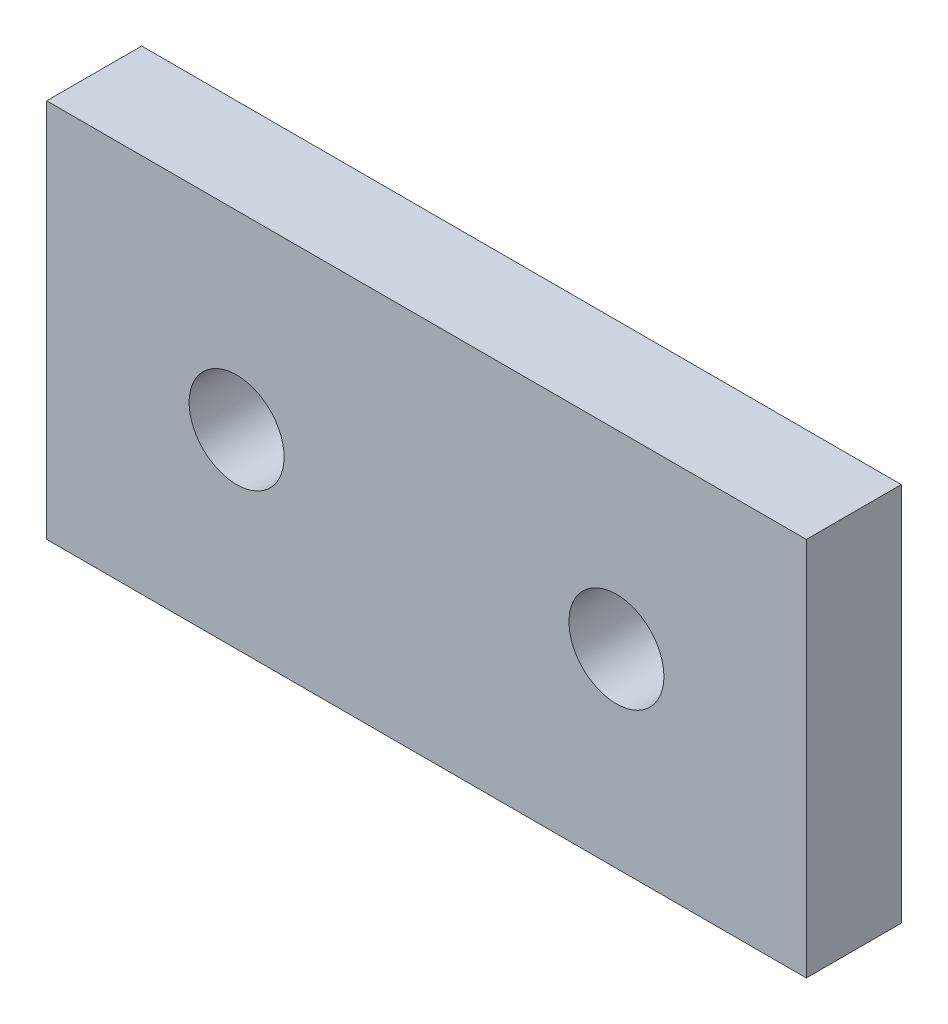
ISO-10303-21;
HEADER;
FILE_DESCRIPTION(('STEP AP214'),'2;1');
FILE_NAME('part.step','',(''),(''),'','','');
FILE_SCHEMA(('AUTOMOTIVE_DESIGN { 1 0 10303 214 1 1 1 1 }'));
ENDSEC;
DATA;
#1=APPLICATION_CONTEXT('core data for automotive mechanical design processes');
#2=APPLICATION_PROTOCOL_DEFINITION('international standard','automotive_design',2000,#1);
#3=PRODUCT_CONTEXT('',#1,'mechanical');
#4=PRODUCT('Part','Part','',(#3));
#5=PRODUCT_RELATED_PRODUCT_CATEGORY('part','',(#4));
#6=PRODUCT_DEFINITION_FORMATION('','',#4);
#7=PRODUCT_DEFINITION_CONTEXT('part definition',#1,'design');
#8=PRODUCT_DEFINITION('design','',#6,#7);
#9=PRODUCT_DEFINITION_SHAPE('','',#8);
#10=(LENGTH_UNIT() NAMED_UNIT(*) SI_UNIT(.MILLI.,.METRE.));
#11=(NAMED_UNIT(*) PLANE_ANGLE_UNIT() SI_UNIT($,.RADIAN.));
#12=(NAMED_UNIT(*) SI_UNIT($,.STERADIAN.) SOLID_ANGLE_UNIT());
#13=UNCERTAINTY_MEASURE_WITH_UNIT(LENGTH_MEASURE(1.E-05),#10,'distance_accuracy_value','');
#14=(GEOMETRIC_REPRESENTATION_CONTEXT(3) GLOBAL_UNCERTAINTY_ASSIGNED_CONTEXT((#13)) GLOBAL_UNIT_ASSIGNED_CONTEXT((#10,
#11,#12)) REPRESENTATION_CONTEXT('',''));
#15=CARTESIAN_POINT('',(0.,0.,0.));
#16=DIRECTION('',(0.,0.,1.));
#17=DIRECTION('',(1.,0.,0.));
#18=AXIS2_PLACEMENT_3D('',#15,#16,#17);
#19=CARTESIAN_POINT('',(0.,40.,5.));
#20=DIRECTION('',(1.,0.,0.));
#21=DIRECTION('',(0.,0.,-1.));
#22=AXIS2_PLACEMENT_3D('',#19,#20,#21);
#23=PLANE('',#22);
#24=DIRECTION('',(0.,-1.,0.));
#25=VECTOR('',#24,1.);
#26=CARTESIAN_POINT('',(0.,40.,-5.));
#27=LINE('',#26,#25);
#28=CARTESIAN_POINT('',(0.,40.,-5.));
#29=VERTEX_POINT('',#28);
#30=CARTESIAN_POINT('',(0.,0.,-5.));
#31=VERTEX_POINT('',#30);
#32=EDGE_CURVE('E120',#29,#31,#27,.T.);
#33=ORIENTED_EDGE('',*,*,#32,.T.);
#34=DIRECTION('',(0.,0.,-1.));
#35=VECTOR('',#34,1.);
#36=CARTESIAN_POINT('',(0.,0.,5.));
#37=LINE('',#36,#35);
#38=CARTESIAN_POINT('',(0.,0.,5.));
#39=VERTEX_POINT('',#38);
#40=EDGE_CURVE('E11',#39,#31,#37,.T.);
#41=ORIENTED_EDGE('',*,*,#40,.F.);
#42=DIRECTION('',(0.,-1.,0.));
#43=VECTOR('',#42,1.);
#44=CARTESIAN_POINT('',(0.,40.,5.));
#45=LINE('',#44,#43);
#46=CARTESIAN_POINT('',(0.,40.,5.));
#47=VERTEX_POINT('',#46);
#48=EDGE_CURVE('E104',#47,#39,#45,.T.);
#49=ORIENTED_EDGE('',*,*,#48,.F.);
#50=DIRECTION('',(0.,0.,-1.));
#51=VECTOR('',#50,1.);
#52=CARTESIAN_POINT('',(0.,40.,5.));
#53=LINE('',#52,#51);
#54=EDGE_CURVE('E116',#47,#29,#53,.T.);
#55=ORIENTED_EDGE('',*,*,#54,.T.);
#56=EDGE_LOOP('',(#33,#41,#49,#55));
#57=FACE_BOUND('',#56,.T.);
#58=ADVANCED_FACE('F51',(#57),#23,.F.);
#59=CARTESIAN_POINT('',(0.,0.,5.));
#60=DIRECTION('',(0.,1.,0.));
#61=DIRECTION('',(0.,0.,1.));
#62=AXIS2_PLACEMENT_3D('',#59,#60,#61);
#63=PLANE('',#62);
#64=DIRECTION('',(1.,0.,0.));
#65=VECTOR('',#64,1.);
#66=CARTESIAN_POINT('',(0.,0.,-5.));
#67=LINE('',#66,#65);
#68=CARTESIAN_POINT('',(80.,0.,-5.));
#69=VERTEX_POINT('',#68);
#70=EDGE_CURVE('E109',#31,#69,#67,.T.);
#71=ORIENTED_EDGE('',*,*,#70,.T.);
#72=DIRECTION('',(0.,0.,-1.));
#73=VECTOR('',#72,1.);
#74=CARTESIAN_POINT('',(80.,0.,5.));
#75=LINE('',#74,#73);
#76=CARTESIAN_POINT('',(80.,0.,5.));
#77=VERTEX_POINT('',#76);
#78=EDGE_CURVE('E61',#77,#69,#75,.T.);
#79=ORIENTED_EDGE('',*,*,#78,.F.);
#80=DIRECTION('',(1.,0.,0.));
#81=VECTOR('',#80,1.);
#82=CARTESIAN_POINT('',(0.,0.,5.));
#83=LINE('',#82,#81);
#84=EDGE_CURVE('E99',#39,#77,#83,.T.);
#85=ORIENTED_EDGE('',*,*,#84,.F.);
#86=ORIENTED_EDGE('',*,*,#40,.T.);
#87=EDGE_LOOP('',(#71,#79,#85,#86));
#88=FACE_BOUND('',#87,.T.);
#89=ADVANCED_FACE('F108',(#88),#63,.F.);
#90=CARTESIAN_POINT('',(80.,0.,5.));
#91=DIRECTION('',(-1.,0.,0.));
#92=DIRECTION('',(0.,0.,1.));
#93=AXIS2_PLACEMENT_3D('',#90,#91,#92);
#94=PLANE('',#93);
#95=DIRECTION('',(0.,1.,0.));
#96=VECTOR('',#95,1.);
#97=CARTESIAN_POINT('',(80.,0.,-5.));
#98=LINE('',#97,#96);
#99=CARTESIAN_POINT('',(80.,40.,-5.));
#100=VERTEX_POINT('',#99);
#101=EDGE_CURVE('E86',#69,#100,#98,.T.);
#102=ORIENTED_EDGE('',*,*,#101,.T.);
#103=DIRECTION('',(0.,0.,-1.));
#104=VECTOR('',#103,1.);
#105=CARTESIAN_POINT('',(80.,40.,5.));
#106=LINE('',#105,#104);
#107=CARTESIAN_POINT('',(80.,40.,5.));
#108=VERTEX_POINT('',#107);
#109=EDGE_CURVE('E111',#108,#100,#106,.T.);
#110=ORIENTED_EDGE('',*,*,#109,.F.);
#111=DIRECTION('',(0.,1.,0.));
#112=VECTOR('',#111,1.);
#113=CARTESIAN_POINT('',(80.,0.,5.));
#114=LINE('',#113,#112);
#115=EDGE_CURVE('E102',#77,#108,#114,.T.);
#116=ORIENTED_EDGE('',*,*,#115,.F.);
#117=ORIENTED_EDGE('',*,*,#78,.T.);
#118=EDGE_LOOP('',(#102,#110,#116,#117));
#119=FACE_BOUND('',#118,.T.);
#120=ADVANCED_FACE('F112',(#119),#94,.F.);
#121=CARTESIAN_POINT('',(80.,40.,5.));
#122=DIRECTION('',(0.,-1.,0.));
#123=DIRECTION('',(0.,0.,-1.));
#124=AXIS2_PLACEMENT_3D('',#121,#122,#123);
#125=PLANE('',#124);
#126=DIRECTION('',(-1.,0.,0.));
#127=VECTOR('',#126,1.);
#128=CARTESIAN_POINT('',(80.,40.,-5.));
#129=LINE('',#128,#127);
#130=EDGE_CURVE('E92',#100,#29,#129,.T.);
#131=ORIENTED_EDGE('',*,*,#130,.T.);
#132=ORIENTED_EDGE('',*,*,#54,.F.);
#133=DIRECTION('',(-1.,0.,0.));
#134=VECTOR('',#133,1.);
#135=CARTESIAN_POINT('',(80.,40.,5.));
#136=LINE('',#135,#134);
#137=EDGE_CURVE('E69',#108,#47,#136,.T.);
#138=ORIENTED_EDGE('',*,*,#137,.F.);
#139=ORIENTED_EDGE('',*,*,#109,.T.);
#140=EDGE_LOOP('',(#131,#132,#138,#139));
#141=FACE_BOUND('',#140,.T.);
#142=ADVANCED_FACE('F135',(#141),#125,.F.);
#143=CARTESIAN_POINT('',(0.,0.,5.));
#144=DIRECTION('',(0.,0.,1.));
#145=DIRECTION('',(1.,0.,0.));
#146=AXIS2_PLACEMENT_3D('',#143,#144,#145);
#147=PLANE('',#146);
#148=CARTESIAN_POINT('',(20.,20.,5.));
#149=DIRECTION('',(0.,0.,1.));
#150=DIRECTION('',(1.,0.,0.));
#151=AXIS2_PLACEMENT_3D('',#148,#149,#150);
#152=CIRCLE('',#151,5.);
#153=CARTESIAN_POINT('',(25.,20.,5.));
#154=VERTEX_POINT('',#153);
#155=EDGE_CURVE('E150',#154,#154,#152,.T.);
#156=ORIENTED_EDGE('',*,*,#155,.F.);
#157=EDGE_LOOP('',(#156));
#158=FACE_BOUND('',#157,.T.);
#159=CARTESIAN_POINT('',(60.,20.,5.));
#160=DIRECTION('',(0.,0.,1.));
#161=DIRECTION('',(1.,0.,0.));
#162=AXIS2_PLACEMENT_3D('',#159,#160,#161);
#163=CIRCLE('',#162,5.);
#164=CARTESIAN_POINT('',(65.,20.,5.));
#165=VERTEX_POINT('',#164);
#166=EDGE_CURVE('E146',#165,#165,#163,.T.);
#167=ORIENTED_EDGE('',*,*,#166,.F.);
#168=EDGE_LOOP('',(#167));
#169=FACE_BOUND('',#168,.T.);
#170=ORIENTED_EDGE('',*,*,#48,.T.);
#171=ORIENTED_EDGE('',*,*,#84,.T.);
#172=ORIENTED_EDGE('',*,*,#115,.T.);
#173=ORIENTED_EDGE('',*,*,#137,.T.);
#174=EDGE_LOOP('',(#170,#171,#172,#173));
#175=FACE_BOUND('',#174,.T.);
#176=ADVANCED_FACE('F100',(#158,#169,#175),#147,.T.);
#177=CARTESIAN_POINT('',(0.,0.,-5.));
#178=DIRECTION('',(0.,0.,1.));
#179=DIRECTION('',(1.,0.,0.));
#180=AXIS2_PLACEMENT_3D('',#177,#178,#179);
#181=PLANE('',#180);
#182=CARTESIAN_POINT('',(20.,20.,-5.));
#183=DIRECTION('',(0.,0.,1.));
#184=DIRECTION('',(1.,0.,0.));
#185=AXIS2_PLACEMENT_3D('',#182,#183,#184);
#186=CIRCLE('',#185,5.);
#187=CARTESIAN_POINT('',(25.,20.,-5.));
#188=VERTEX_POINT('',#187);
#189=EDGE_CURVE('E124',#188,#188,#186,.T.);
#190=ORIENTED_EDGE('',*,*,#189,.T.);
#191=EDGE_LOOP('',(#190));
#192=FACE_BOUND('',#191,.T.);
#193=CARTESIAN_POINT('',(60.,20.,-5.));
#194=DIRECTION('',(0.,0.,1.));
#195=DIRECTION('',(1.,0.,0.));
#196=AXIS2_PLACEMENT_3D('',#193,#194,#195);
#197=CIRCLE('',#196,5.);
#198=CARTESIAN_POINT('',(65.,20.,-5.));
#199=VERTEX_POINT('',#198);
#200=EDGE_CURVE('E143',#199,#199,#197,.T.);
#201=ORIENTED_EDGE('',*,*,#200,.T.);
#202=EDGE_LOOP('',(#201));
#203=FACE_BOUND('',#202,.T.);
#204=ORIENTED_EDGE('',*,*,#32,.F.);
#205=ORIENTED_EDGE('',*,*,#130,.F.);
#206=ORIENTED_EDGE('',*,*,#101,.F.);
#207=ORIENTED_EDGE('',*,*,#70,.F.);
#208=EDGE_LOOP('',(#204,#205,#206,#207));
#209=FACE_BOUND('',#208,.T.);
#210=ADVANCED_FACE('F138',(#192,#203,#209),#181,.F.);
#211=CARTESIAN_POINT('',(60.,20.,-5.));
#212=DIRECTION('',(0.,0.,1.));
#213=DIRECTION('',(1.,0.,0.));
#214=AXIS2_PLACEMENT_3D('',#211,#212,#213);
#215=CYLINDRICAL_SURFACE('',#214,5.);
#216=ORIENTED_EDGE('',*,*,#200,.F.);
#217=EDGE_LOOP('',(#216));
#218=FACE_BOUND('',#217,.T.);
#219=ORIENTED_EDGE('',*,*,#166,.T.);
#220=EDGE_LOOP('',(#219));
#221=FACE_BOUND('',#220,.T.);
#222=ADVANCED_FACE('F162',(#218,#221),#215,.F.);
#223=CARTESIAN_POINT('',(20.,20.,-5.));
#224=DIRECTION('',(0.,0.,1.));
#225=DIRECTION('',(1.,0.,0.));
#226=AXIS2_PLACEMENT_3D('',#223,#224,#225);
#227=CYLINDRICAL_SURFACE('',#226,5.);
#228=ORIENTED_EDGE('',*,*,#189,.F.);
#229=EDGE_LOOP('',(#228));
#230=FACE_BOUND('',#229,.T.);
#231=ORIENTED_EDGE('',*,*,#155,.T.);
#232=EDGE_LOOP('',(#231));
#233=FACE_BOUND('',#232,.T.);
#234=ADVANCED_FACE('F159',(#230,#233),#227,.F.);
#235=CLOSED_SHELL('',(#58,#89,#120,#142,#176,#210,#222,#234));
#236=MANIFOLD_SOLID_BREP('B2',#235);
#237=ADVANCED_BREP_SHAPE_REPRESENTATION('',(#18,#236),#14);
#238=SHAPE_DEFINITION_REPRESENTATION(#9,#237);
ENDSEC;
END-ISO-10303-21;
